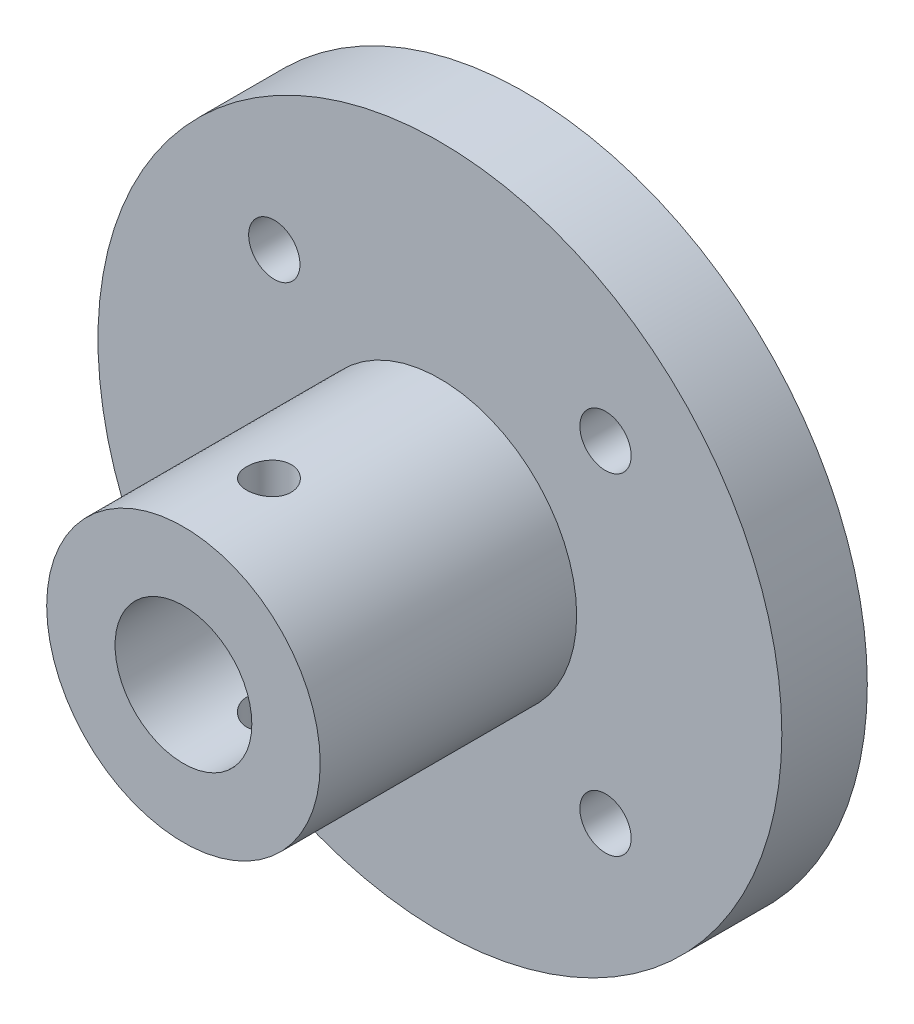
ISO-10303-21;
HEADER;
FILE_DESCRIPTION(('STEP AP214'),'2;1');
FILE_NAME('part.step','',(''),(''),'','','');
FILE_SCHEMA(('AUTOMOTIVE_DESIGN { 1 0 10303 214 1 1 1 1 }'));
ENDSEC;
DATA;
#1=APPLICATION_CONTEXT('core data for automotive mechanical design processes');
#2=APPLICATION_PROTOCOL_DEFINITION('international standard','automotive_design',2000,#1);
#3=PRODUCT_CONTEXT('',#1,'mechanical');
#4=PRODUCT('Part','Part','',(#3));
#5=PRODUCT_RELATED_PRODUCT_CATEGORY('part','',(#4));
#6=PRODUCT_DEFINITION_FORMATION('','',#4);
#7=PRODUCT_DEFINITION_CONTEXT('part definition',#1,'design');
#8=PRODUCT_DEFINITION('design','',#6,#7);
#9=PRODUCT_DEFINITION_SHAPE('','',#8);
#10=(LENGTH_UNIT() NAMED_UNIT(*) SI_UNIT(.MILLI.,.METRE.));
#11=(NAMED_UNIT(*) PLANE_ANGLE_UNIT() SI_UNIT($,.RADIAN.));
#12=(NAMED_UNIT(*) SI_UNIT($,.STERADIAN.) SOLID_ANGLE_UNIT());
#13=UNCERTAINTY_MEASURE_WITH_UNIT(LENGTH_MEASURE(1.E-05),#10,'distance_accuracy_value','');
#14=(GEOMETRIC_REPRESENTATION_CONTEXT(3) GLOBAL_UNCERTAINTY_ASSIGNED_CONTEXT((#13)) GLOBAL_UNIT_ASSIGNED_CONTEXT((#10,
#11,#12)) REPRESENTATION_CONTEXT('',''));
#15=CARTESIAN_POINT('',(0.,0.,0.));
#16=DIRECTION('',(0.,0.,1.));
#17=DIRECTION('',(1.,0.,0.));
#18=AXIS2_PLACEMENT_3D('',#15,#16,#17);
#19=CARTESIAN_POINT('',(0.,0.,5.));
#20=DIRECTION('',(0.,0.,1.));
#21=DIRECTION('',(1.,0.,0.));
#22=AXIS2_PLACEMENT_3D('',#19,#20,#21);
#23=PLANE('',#22);
#24=CARTESIAN_POINT('',(-9.68620346185681,-9.68620346185671,5.));
#25=DIRECTION('',(0.,0.,1.));
#26=DIRECTION('',(-1.,0.,0.));
#27=AXIS2_PLACEMENT_3D('',#24,#25,#26);
#28=CIRCLE('',#27,1.5);
#29=CARTESIAN_POINT('',(-11.1862034618568,-9.68620346185671,5.));
#30=VERTEX_POINT('',#29);
#31=EDGE_CURVE('E122',#30,#30,#28,.T.);
#32=ORIENTED_EDGE('',*,*,#31,.F.);
#33=EDGE_LOOP('',(#32));
#34=FACE_BOUND('',#33,.T.);
#35=CARTESIAN_POINT('',(9.68620346185681,9.68620346185671,5.));
#36=DIRECTION('',(0.,0.,1.));
#37=DIRECTION('',(-1.,0.,0.));
#38=AXIS2_PLACEMENT_3D('',#35,#36,#37);
#39=CIRCLE('',#38,1.5);
#40=CARTESIAN_POINT('',(8.18620346185681,9.68620346185671,5.));
#41=VERTEX_POINT('',#40);
#42=EDGE_CURVE('E136',#41,#41,#39,.T.);
#43=ORIENTED_EDGE('',*,*,#42,.F.);
#44=EDGE_LOOP('',(#43));
#45=FACE_BOUND('',#44,.T.);
#46=CARTESIAN_POINT('',(0.,0.,5.));
#47=DIRECTION('',(0.,0.,1.));
#48=DIRECTION('',(1.,0.,0.));
#49=AXIS2_PLACEMENT_3D('',#46,#47,#48);
#50=CIRCLE('',#49,20.);
#51=CARTESIAN_POINT('',(20.,0.,5.));
#52=VERTEX_POINT('',#51);
#53=EDGE_CURVE('E10',#52,#52,#50,.T.);
#54=ORIENTED_EDGE('',*,*,#53,.T.);
#55=EDGE_LOOP('',(#54));
#56=FACE_BOUND('',#55,.T.);
#57=CARTESIAN_POINT('',(-9.68620346185681,9.68620346185671,5.));
#58=DIRECTION('',(0.,0.,1.));
#59=DIRECTION('',(1.,0.,0.));
#60=AXIS2_PLACEMENT_3D('',#57,#58,#59);
#61=CIRCLE('',#60,1.5);
#62=CARTESIAN_POINT('',(-8.18620346185681,9.68620346185671,5.));
#63=VERTEX_POINT('',#62);
#64=EDGE_CURVE('E140',#63,#63,#61,.T.);
#65=ORIENTED_EDGE('',*,*,#64,.F.);
#66=EDGE_LOOP('',(#65));
#67=FACE_BOUND('',#66,.T.);
#68=CARTESIAN_POINT('',(9.68620346185681,-9.68620346185671,5.));
#69=DIRECTION('',(0.,0.,1.));
#70=DIRECTION('',(1.,0.,0.));
#71=AXIS2_PLACEMENT_3D('',#68,#69,#70);
#72=CIRCLE('',#71,1.5);
#73=CARTESIAN_POINT('',(11.1862034618568,-9.68620346185671,5.));
#74=VERTEX_POINT('',#73);
#75=EDGE_CURVE('E132',#74,#74,#72,.T.);
#76=ORIENTED_EDGE('',*,*,#75,.F.);
#77=EDGE_LOOP('',(#76));
#78=FACE_BOUND('',#77,.T.);
#79=CARTESIAN_POINT('',(0.,0.,5.));
#80=DIRECTION('',(0.,0.,1.));
#81=DIRECTION('',(1.,0.,0.));
#82=AXIS2_PLACEMENT_3D('',#79,#80,#81);
#83=CIRCLE('',#82,8.);
#84=CARTESIAN_POINT('',(8.,0.,5.));
#85=VERTEX_POINT('',#84);
#86=EDGE_CURVE('E128',#85,#85,#83,.T.);
#87=ORIENTED_EDGE('',*,*,#86,.F.);
#88=EDGE_LOOP('',(#87));
#89=FACE_BOUND('',#88,.T.);
#90=ADVANCED_FACE('F30',(#34,#45,#56,#67,#78,#89),#23,.T.);
#91=CARTESIAN_POINT('',(0.,0.,0.));
#92=DIRECTION('',(0.,0.,1.));
#93=DIRECTION('',(1.,0.,0.));
#94=AXIS2_PLACEMENT_3D('',#91,#92,#93);
#95=PLANE('',#94);
#96=CARTESIAN_POINT('',(0.,0.,0.));
#97=DIRECTION('',(0.,0.,1.));
#98=DIRECTION('',(1.,0.,0.));
#99=AXIS2_PLACEMENT_3D('',#96,#97,#98);
#100=CIRCLE('',#99,20.);
#101=CARTESIAN_POINT('',(20.,0.,0.));
#102=VERTEX_POINT('',#101);
#103=EDGE_CURVE('E43',#102,#102,#100,.T.);
#104=ORIENTED_EDGE('',*,*,#103,.F.);
#105=EDGE_LOOP('',(#104));
#106=FACE_BOUND('',#105,.T.);
#107=CARTESIAN_POINT('',(0.,0.,0.));
#108=DIRECTION('',(0.,0.,1.));
#109=DIRECTION('',(1.,0.,0.));
#110=AXIS2_PLACEMENT_3D('',#107,#108,#109);
#111=CIRCLE('',#110,4.);
#112=CARTESIAN_POINT('',(4.,0.,0.));
#113=VERTEX_POINT('',#112);
#114=EDGE_CURVE('E48',#113,#113,#111,.T.);
#115=ORIENTED_EDGE('',*,*,#114,.T.);
#116=EDGE_LOOP('',(#115));
#117=FACE_BOUND('',#116,.T.);
#118=CARTESIAN_POINT('',(-9.68620346185681,9.68620346185671,0.));
#119=DIRECTION('',(0.,0.,1.));
#120=DIRECTION('',(1.,0.,0.));
#121=AXIS2_PLACEMENT_3D('',#118,#119,#120);
#122=CIRCLE('',#121,1.5);
#123=CARTESIAN_POINT('',(-8.18620346185681,9.68620346185671,0.));
#124=VERTEX_POINT('',#123);
#125=EDGE_CURVE('E109',#124,#124,#122,.T.);
#126=ORIENTED_EDGE('',*,*,#125,.T.);
#127=EDGE_LOOP('',(#126));
#128=FACE_BOUND('',#127,.T.);
#129=CARTESIAN_POINT('',(9.68620346185681,9.68620346185671,0.));
#130=DIRECTION('',(0.,0.,1.));
#131=DIRECTION('',(-1.,0.,0.));
#132=AXIS2_PLACEMENT_3D('',#129,#130,#131);
#133=CIRCLE('',#132,1.5);
#134=CARTESIAN_POINT('',(8.18620346185681,9.68620346185671,0.));
#135=VERTEX_POINT('',#134);
#136=EDGE_CURVE('E113',#135,#135,#133,.T.);
#137=ORIENTED_EDGE('',*,*,#136,.T.);
#138=EDGE_LOOP('',(#137));
#139=FACE_BOUND('',#138,.T.);
#140=CARTESIAN_POINT('',(9.68620346185681,-9.68620346185671,0.));
#141=DIRECTION('',(0.,0.,1.));
#142=DIRECTION('',(1.,0.,0.));
#143=AXIS2_PLACEMENT_3D('',#140,#141,#142);
#144=CIRCLE('',#143,1.5);
#145=CARTESIAN_POINT('',(11.1862034618568,-9.68620346185671,0.));
#146=VERTEX_POINT('',#145);
#147=EDGE_CURVE('E117',#146,#146,#144,.T.);
#148=ORIENTED_EDGE('',*,*,#147,.T.);
#149=EDGE_LOOP('',(#148));
#150=FACE_BOUND('',#149,.T.);
#151=CARTESIAN_POINT('',(-9.68620346185681,-9.68620346185671,0.));
#152=DIRECTION('',(0.,0.,1.));
#153=DIRECTION('',(-1.,0.,0.));
#154=AXIS2_PLACEMENT_3D('',#151,#152,#153);
#155=CIRCLE('',#154,1.5);
#156=CARTESIAN_POINT('',(-11.1862034618568,-9.68620346185671,0.));
#157=VERTEX_POINT('',#156);
#158=EDGE_CURVE('E120',#157,#157,#155,.T.);
#159=ORIENTED_EDGE('',*,*,#158,.T.);
#160=EDGE_LOOP('',(#159));
#161=FACE_BOUND('',#160,.T.);
#162=ADVANCED_FACE('F93',(#106,#117,#128,#139,#150,#161),#95,.F.);
#163=CARTESIAN_POINT('',(0.,0.,5.));
#164=DIRECTION('',(0.,0.,-1.));
#165=DIRECTION('',(-1.,0.,0.));
#166=AXIS2_PLACEMENT_3D('',#163,#164,#165);
#167=CYLINDRICAL_SURFACE('',#166,20.);
#168=ORIENTED_EDGE('',*,*,#53,.F.);
#169=EDGE_LOOP('',(#168));
#170=FACE_BOUND('',#169,.T.);
#171=ORIENTED_EDGE('',*,*,#103,.T.);
#172=EDGE_LOOP('',(#171));
#173=FACE_BOUND('',#172,.T.);
#174=ADVANCED_FACE('F32',(#170,#173),#167,.T.);
#175=CARTESIAN_POINT('',(0.,0.,5.));
#176=DIRECTION('',(0.,0.,-1.));
#177=DIRECTION('',(-1.,0.,0.));
#178=AXIS2_PLACEMENT_3D('',#175,#176,#177);
#179=CYLINDRICAL_SURFACE('',#178,4.);
#180=CARTESIAN_POINT('',(0.,-4.,16.301925597688));
#181=CARTESIAN_POINT('',(0.0711312767951833,-3.99999997065091,16.3019256080283));
#182=CARTESIAN_POINT('',(0.142263208172782,-3.99808497215068,16.2960771024727));
#183=CARTESIAN_POINT('',(0.282437597376648,-3.99063390056981,16.2729052396162));
#184=CARTESIAN_POINT('',(0.351479739510248,-3.98509728321988,16.2555801575712));
#185=CARTESIAN_POINT('',(0.485433296175607,-3.97100581867374,16.2101079058586));
#186=CARTESIAN_POINT('',(0.55035122276099,-3.96245587668184,16.1819783175314));
#187=CARTESIAN_POINT('',(0.674548310374873,-3.9432143122473,16.1157732317819));
#188=CARTESIAN_POINT('',(0.733826439454097,-3.93252229896369,16.0776959189182));
#189=CARTESIAN_POINT('',(0.847029670563523,-3.90972846523015,15.9913471959365));
#190=CARTESIAN_POINT('',(0.900741471601737,-3.89759402865785,15.9428048012214));
#191=CARTESIAN_POINT('',(0.999423254499997,-3.87346600301855,15.8374803057087));
#192=CARTESIAN_POINT('',(1.04439142908575,-3.86147244355064,15.7806965056711));
#193=CARTESIAN_POINT('',(1.12550349477691,-3.83862869681929,15.6586091641631));
#194=CARTESIAN_POINT('',(1.16137427174797,-3.82781845461147,15.5931159812989));
#195=CARTESIAN_POINT('',(1.22150212221196,-3.8090591858432,15.4566178616921));
#196=CARTESIAN_POINT('',(1.2457625520848,-3.80110933255166,15.3856145247599));
#197=CARTESIAN_POINT('',(1.28118839331915,-3.78931351890477,15.242530263145));
#198=CARTESIAN_POINT('',(1.29275198118555,-3.78534313545761,15.1705584763495));
#199=CARTESIAN_POINT('',(1.30370036407857,-3.78158723404663,15.0255952092063));
#200=CARTESIAN_POINT('',(1.30308871699972,-3.78180049352214,14.952604032979));
#201=CARTESIAN_POINT('',(1.29001401704156,-3.78627844121784,14.8110300076271));
#202=CARTESIAN_POINT('',(1.27806534027109,-3.79036728103718,14.7423931385648));
#203=CARTESIAN_POINT('',(1.24349291036263,-3.80184873273346,14.608157066084));
#204=CARTESIAN_POINT('',(1.22086793460044,-3.80924172298867,14.5425582115166));
#205=CARTESIAN_POINT('',(1.16523835255127,-3.82662737214615,14.415069959991));
#206=CARTESIAN_POINT('',(1.13207786681771,-3.83665865526414,14.3532540755556));
#207=CARTESIAN_POINT('',(1.05642678798222,-3.85817385587477,14.2358992193946));
#208=CARTESIAN_POINT('',(1.01393360202195,-3.8696581766811,14.1803619985474));
#209=CARTESIAN_POINT('',(0.918332331110465,-3.89348252495641,14.0742437088007));
#210=CARTESIAN_POINT('',(0.864802122619727,-3.90583673490822,14.0240453647229));
#211=CARTESIAN_POINT('',(0.749930487003,-3.92950873282928,13.9332408405631));
#212=CARTESIAN_POINT('',(0.68858837961372,-3.94082643039087,13.8926354967238));
#213=CARTESIAN_POINT('',(0.559051032473993,-3.9612869666028,13.8218804524946));
#214=CARTESIAN_POINT('',(0.490798661954853,-3.97040914028853,13.7918289625452));
#215=CARTESIAN_POINT('',(0.349840187583072,-3.98530115684558,13.7437507455386));
#216=CARTESIAN_POINT('',(0.277135564473433,-3.99107210765427,13.7257200440338));
#217=CARTESIAN_POINT('',(0.132579747106289,-3.9984299209816,13.7028632328306));
#218=CARTESIAN_POINT('',(0.0608186096184757,-4.0001806688817,13.6975196021805));
#219=CARTESIAN_POINT('',(-0.0825865396790195,-3.99978971594145,13.6987201927588));
#220=CARTESIAN_POINT('',(-0.154230568389887,-3.99764863777213,13.7052625122997));
#221=CARTESIAN_POINT('',(-0.29332534584699,-3.98982262100815,13.7296374034796));
#222=CARTESIAN_POINT('',(-0.360837195106434,-3.98423628439791,13.7471560516628));
#223=CARTESIAN_POINT('',(-0.491939580492501,-3.97018209613516,13.7925974527317));
#224=CARTESIAN_POINT('',(-0.555529620463851,-3.9617138807706,13.820521518892));
#225=CARTESIAN_POINT('',(-0.678796591545226,-3.94249015618977,13.8867763598731));
#226=CARTESIAN_POINT('',(-0.738331648481139,-3.9316816357184,13.9253552764454));
#227=CARTESIAN_POINT('',(-0.850253337899065,-3.90900696570667,14.0115308657244));
#228=CARTESIAN_POINT('',(-0.902637871151955,-3.89714050726306,14.0591301768581));
#229=CARTESIAN_POINT('',(-1.00112459881444,-3.87303924238307,14.1644299347823));
#230=CARTESIAN_POINT('',(-1.04685758759963,-3.86081067179762,14.2224779446436));
#231=CARTESIAN_POINT('',(-1.12797430769858,-3.83789741641931,14.3456885193407));
#232=CARTESIAN_POINT('',(-1.16335805873627,-3.82721272868407,14.4108510706172));
#233=CARTESIAN_POINT('',(-1.22258385990192,-3.80870772235245,14.5464014694246));
#234=CARTESIAN_POINT('',(-1.24645828063114,-3.8008793853958,14.6167740119395));
#235=CARTESIAN_POINT('',(-1.2819189271213,-3.78906848592847,14.7608517057937));
#236=CARTESIAN_POINT('',(-1.2935103516984,-3.7850842964344,14.8345554334151));
#237=CARTESIAN_POINT('',(-1.30368248353493,-3.78159196355162,14.9793168745868));
#238=CARTESIAN_POINT('',(-1.30287320261135,-3.78187395064302,15.050327157676));
#239=CARTESIAN_POINT('',(-1.28975719355775,-3.78636677154468,15.1911447383842));
#240=CARTESIAN_POINT('',(-1.27745109051814,-3.79057739175234,15.2609521011967));
#241=CARTESIAN_POINT('',(-1.24211382967101,-3.8023003837088,15.39618946864));
#242=CARTESIAN_POINT('',(-1.21927136443201,-3.80975454004352,15.4616742148027));
#243=CARTESIAN_POINT('',(-1.16366087742788,-3.82710567421522,15.5879328447442));
#244=CARTESIAN_POINT('',(-1.13089071962521,-3.83700317767667,15.6487057111795));
#245=CARTESIAN_POINT('',(-1.05475011947038,-3.85864340925751,15.7665764057782));
#246=CARTESIAN_POINT('',(-1.01099278309618,-3.87044611152815,15.8234132507106));
#247=CARTESIAN_POINT('',(-0.914784185971263,-3.89430649647427,15.9291346414175));
#248=CARTESIAN_POINT('',(-0.862330519280606,-3.90636424890468,15.9780169790491));
#249=CARTESIAN_POINT('',(-0.747917545427117,-3.92990432370083,16.068235422746));
#250=CARTESIAN_POINT('',(-0.685681177634975,-3.9413495824801,16.1092309949832));
#251=CARTESIAN_POINT('',(-0.554830535895198,-3.96188587496537,16.1801295573846));
#252=CARTESIAN_POINT('',(-0.486218244138148,-3.97097763703696,16.210035980686));
#253=CARTESIAN_POINT('',(-0.348808825416258,-3.9853247740496,16.25629548467));
#254=CARTESIAN_POINT('',(-0.280269838762676,-3.99077761685879,16.2733541571706));
#255=CARTESIAN_POINT('',(-0.141153779142634,-3.99811480555621,16.2961678184661));
#256=CARTESIAN_POINT('',(-0.0705772117836242,-4.00000002912048,16.3019255874283));
#257=CARTESIAN_POINT('',(0.,-4.,16.301925597688));
#258=B_SPLINE_CURVE_WITH_KNOTS('',3,(#180,#181,#182,#183,#184,#185,#186,#187,#188,#189,#190,
#191,#192,#193,#194,#195,#196,#197,#198,#199,#200,#201,#202,#203,#204,#205,#206,#207,#208,#209,
#210,#211,#212,#213,#214,#215,#216,#217,#218,#219,#220,#221,#222,#223,#224,#225,#226,#227,#228,
#229,#230,#231,#232,#233,#234,#235,#236,#237,#238,#239,#240,#241,#242,#243,#244,#245,#246,#247,
#248,#249,#250,#251,#252,#253,#254,#255,#256,#257),.UNSPECIFIED.,.T.,.F.,(4,2,2,2,2,2,2,2,2,2,2,
2,2,2,2,2,2,2,2,2,2,2,2,2,2,2,2,2,2,2,2,2,2,2,2,2,2,2,4),(0.,0.213134225870454,
0.426300489643393,0.639121343914474,0.851981064766217,1.07121127660868,1.2904867544428,
1.51572310806076,1.74089430978393,1.9587823613108,2.17660674167868,2.38499816507355,
2.59341345874899,2.80506846796922,3.01678235481538,3.23900269629243,3.46124240205501,
3.6854985637765,3.90968054259402,4.12454779063682,4.33938066411337,4.54833340887738,
4.75731253463718,4.97164223198679,5.18603471688999,5.40968987899122,5.63334461484,
5.85636658580742,6.07929412428547,6.29129224936504,6.50327884862627,6.71160823150684,
6.91998247031033,7.13709485259694,7.35426740206832,7.57936621971548,7.80439528974902,
8.01592138739103,8.22739544037214),.UNSPECIFIED.);
#259=CARTESIAN_POINT('',(0.,-4.,16.301925597688));
#260=VERTEX_POINT('',#259);
#261=EDGE_CURVE('E78',#260,#260,#258,.T.);
#262=ORIENTED_EDGE('',*,*,#261,.F.);
#263=EDGE_LOOP('',(#262));
#264=FACE_BOUND('',#263,.T.);
#265=CARTESIAN_POINT('',(0.,4.,16.301925597688));
#266=CARTESIAN_POINT('',(-0.0711312767951798,3.99999997065091,16.3019256080283));
#267=CARTESIAN_POINT('',(-0.142263208172778,3.99808497215068,16.2960771024727));
#268=CARTESIAN_POINT('',(-0.282437597376644,3.99063390056981,16.2729052396162));
#269=CARTESIAN_POINT('',(-0.351479739510245,3.98509728321988,16.2555801575712));
#270=CARTESIAN_POINT('',(-0.485433296175603,3.97100581867374,16.2101079058586));
#271=CARTESIAN_POINT('',(-0.550351222760986,3.96245587668184,16.1819783175314));
#272=CARTESIAN_POINT('',(-0.674548310374869,3.9432143122473,16.1157732317819));
#273=CARTESIAN_POINT('',(-0.733826439454093,3.93252229896369,16.0776959189182));
#274=CARTESIAN_POINT('',(-0.847029670563519,3.90972846523015,15.9913471959365));
#275=CARTESIAN_POINT('',(-0.900741471601734,3.89759402865785,15.9428048012214));
#276=CARTESIAN_POINT('',(-0.999423254499993,3.87346600301855,15.8374803057087));
#277=CARTESIAN_POINT('',(-1.04439142908575,3.86147244355064,15.7806965056711));
#278=CARTESIAN_POINT('',(-1.12550349477691,3.83862869681929,15.6586091641631));
#279=CARTESIAN_POINT('',(-1.16137427174796,3.82781845461147,15.5931159812989));
#280=CARTESIAN_POINT('',(-1.22150212221195,3.8090591858432,15.4566178616921));
#281=CARTESIAN_POINT('',(-1.2457625520848,3.80110933255166,15.3856145247599));
#282=CARTESIAN_POINT('',(-1.28118839331915,3.78931351890477,15.242530263145));
#283=CARTESIAN_POINT('',(-1.29275198118554,3.78534313545761,15.1705584763495));
#284=CARTESIAN_POINT('',(-1.30370036407857,3.78158723404663,15.0255952092063));
#285=CARTESIAN_POINT('',(-1.30308871699971,3.78180049352214,14.952604032979));
#286=CARTESIAN_POINT('',(-1.29001401704156,3.78627844121784,14.8110300076271));
#287=CARTESIAN_POINT('',(-1.27806534027109,3.79036728103718,14.7423931385648));
#288=CARTESIAN_POINT('',(-1.24349291036263,3.80184873273346,14.608157066084));
#289=CARTESIAN_POINT('',(-1.22086793460043,3.80924172298867,14.5425582115166));
#290=CARTESIAN_POINT('',(-1.16523835255127,3.82662737214615,14.415069959991));
#291=CARTESIAN_POINT('',(-1.13207786681771,3.83665865526415,14.3532540755556));
#292=CARTESIAN_POINT('',(-1.05642678798221,3.85817385587477,14.2358992193946));
#293=CARTESIAN_POINT('',(-1.01393360202194,3.8696581766811,14.1803619985474));
#294=CARTESIAN_POINT('',(-0.918332331110462,3.89348252495641,14.0742437088007));
#295=CARTESIAN_POINT('',(-0.864802122619723,3.90583673490822,14.0240453647229));
#296=CARTESIAN_POINT('',(-0.749930487002996,3.92950873282928,13.9332408405631));
#297=CARTESIAN_POINT('',(-0.688588379613716,3.94082643039087,13.8926354967238));
#298=CARTESIAN_POINT('',(-0.559051032473989,3.9612869666028,13.8218804524946));
#299=CARTESIAN_POINT('',(-0.490798661954849,3.97040914028853,13.7918289625452));
#300=CARTESIAN_POINT('',(-0.349840187583068,3.98530115684558,13.7437507455386));
#301=CARTESIAN_POINT('',(-0.277135564473429,3.99107210765427,13.7257200440338));
#302=CARTESIAN_POINT('',(-0.132579747106286,3.9984299209816,13.7028632328306));
#303=CARTESIAN_POINT('',(-0.0608186096184719,4.0001806688817,13.6975196021805));
#304=CARTESIAN_POINT('',(0.0825865396790233,3.99978971594145,13.6987201927588));
#305=CARTESIAN_POINT('',(0.154230568389891,3.99764863777213,13.7052625122997));
#306=CARTESIAN_POINT('',(0.293325345846994,3.98982262100815,13.7296374034796));
#307=CARTESIAN_POINT('',(0.360837195106438,3.98423628439791,13.7471560516628));
#308=CARTESIAN_POINT('',(0.491939580492506,3.97018209613516,13.7925974527317));
#309=CARTESIAN_POINT('',(0.555529620463855,3.9617138807706,13.820521518892));
#310=CARTESIAN_POINT('',(0.67879659154523,3.94249015618977,13.8867763598731));
#311=CARTESIAN_POINT('',(0.738331648481142,3.9316816357184,13.9253552764454));
#312=CARTESIAN_POINT('',(0.850253337899068,3.90900696570667,14.0115308657244));
#313=CARTESIAN_POINT('',(0.902637871151959,3.89714050726306,14.0591301768581));
#314=CARTESIAN_POINT('',(1.00112459881444,3.87303924238307,14.1644299347823));
#315=CARTESIAN_POINT('',(1.04685758759963,3.86081067179762,14.2224779446436));
#316=CARTESIAN_POINT('',(1.12797430769858,3.8378974164193,14.3456885193407));
#317=CARTESIAN_POINT('',(1.16335805873628,3.82721272868407,14.4108510706172));
#318=CARTESIAN_POINT('',(1.22258385990193,3.80870772235244,14.5464014694246));
#319=CARTESIAN_POINT('',(1.24645828063114,3.8008793853958,14.6167740119395));
#320=CARTESIAN_POINT('',(1.2819189271213,3.78906848592847,14.7608517057937));
#321=CARTESIAN_POINT('',(1.2935103516984,3.7850842964344,14.8345554334151));
#322=CARTESIAN_POINT('',(1.30368248353493,3.78159196355161,14.9793168745868));
#323=CARTESIAN_POINT('',(1.30287320261135,3.78187395064302,15.050327157676));
#324=CARTESIAN_POINT('',(1.28975719355775,3.78636677154468,15.1911447383842));
#325=CARTESIAN_POINT('',(1.27745109051814,3.79057739175234,15.2609521011967));
#326=CARTESIAN_POINT('',(1.24211382967102,3.8023003837088,15.39618946864));
#327=CARTESIAN_POINT('',(1.21927136443201,3.80975454004351,15.4616742148027));
#328=CARTESIAN_POINT('',(1.16366087742789,3.82710567421522,15.5879328447442));
#329=CARTESIAN_POINT('',(1.13089071962521,3.83700317767667,15.6487057111795));
#330=CARTESIAN_POINT('',(1.05475011947038,3.85864340925751,15.7665764057782));
#331=CARTESIAN_POINT('',(1.01099278309618,3.87044611152814,15.8234132507106));
#332=CARTESIAN_POINT('',(0.914784185971266,3.89430649647427,15.9291346414175));
#333=CARTESIAN_POINT('',(0.862330519280609,3.90636424890468,15.9780169790491));
#334=CARTESIAN_POINT('',(0.74791754542712,3.92990432370083,16.068235422746));
#335=CARTESIAN_POINT('',(0.685681177634978,3.9413495824801,16.1092309949832));
#336=CARTESIAN_POINT('',(0.554830535895201,3.96188587496537,16.1801295573846));
#337=CARTESIAN_POINT('',(0.486218244138151,3.97097763703696,16.210035980686));
#338=CARTESIAN_POINT('',(0.348808825416261,3.9853247740496,16.25629548467));
#339=CARTESIAN_POINT('',(0.280269838762679,3.99077761685879,16.2733541571706));
#340=CARTESIAN_POINT('',(0.141153779142638,3.99811480555621,16.2961678184661));
#341=CARTESIAN_POINT('',(0.0705772117836276,4.00000002912048,16.3019255874283));
#342=CARTESIAN_POINT('',(0.,4.,16.301925597688));
#343=B_SPLINE_CURVE_WITH_KNOTS('',3,(#265,#266,#267,#268,#269,#270,#271,#272,#273,#274,#275,
#276,#277,#278,#279,#280,#281,#282,#283,#284,#285,#286,#287,#288,#289,#290,#291,#292,#293,#294,
#295,#296,#297,#298,#299,#300,#301,#302,#303,#304,#305,#306,#307,#308,#309,#310,#311,#312,#313,
#314,#315,#316,#317,#318,#319,#320,#321,#322,#323,#324,#325,#326,#327,#328,#329,#330,#331,#332,
#333,#334,#335,#336,#337,#338,#339,#340,#341,#342),.UNSPECIFIED.,.T.,.F.,(4,2,2,2,2,2,2,2,2,2,2,
2,2,2,2,2,2,2,2,2,2,2,2,2,2,2,2,2,2,2,2,2,2,2,2,2,2,2,4),(0.,0.213134225870454,
0.426300489643393,0.639121343914474,0.851981064766217,1.07121127660868,1.2904867544428,
1.51572310806076,1.74089430978393,1.9587823613108,2.17660674167868,2.38499816507355,
2.59341345874899,2.80506846796922,3.01678235481538,3.23900269629243,3.46124240205501,
3.6854985637765,3.90968054259402,4.12454779063682,4.33938066411337,4.54833340887738,
4.75731253463718,4.97164223198679,5.18603471688999,5.40968987899122,5.63334461484,
5.85636658580742,6.07929412428547,6.29129224936505,6.50327884862627,6.71160823150684,
6.91998247031033,7.13709485259694,7.35426740206832,7.57936621971548,7.80439528974902,
8.01592138739103,8.22739544037214),.UNSPECIFIED.);
#344=CARTESIAN_POINT('',(0.,4.,16.301925597688));
#345=VERTEX_POINT('',#344);
#346=EDGE_CURVE('E72',#345,#345,#343,.T.);
#347=ORIENTED_EDGE('',*,*,#346,.F.);
#348=EDGE_LOOP('',(#347));
#349=FACE_BOUND('',#348,.T.);
#350=ORIENTED_EDGE('',*,*,#114,.F.);
#351=EDGE_LOOP('',(#350));
#352=FACE_BOUND('',#351,.T.);
#353=CARTESIAN_POINT('',(0.,0.,20.));
#354=DIRECTION('',(0.,0.,1.));
#355=DIRECTION('',(1.,0.,0.));
#356=AXIS2_PLACEMENT_3D('',#353,#354,#355);
#357=CIRCLE('',#356,4.);
#358=CARTESIAN_POINT('',(4.,0.,20.));
#359=VERTEX_POINT('',#358);
#360=EDGE_CURVE('E152',#359,#359,#357,.T.);
#361=ORIENTED_EDGE('',*,*,#360,.T.);
#362=EDGE_LOOP('',(#361));
#363=FACE_BOUND('',#362,.T.);
#364=ADVANCED_FACE('F83',(#264,#349,#352,#363),#179,.F.);
#365=CARTESIAN_POINT('',(-9.68620346185681,9.68620346185671,5.));
#366=DIRECTION('',(0.,0.,-1.));
#367=DIRECTION('',(-1.,0.,0.));
#368=AXIS2_PLACEMENT_3D('',#365,#366,#367);
#369=CYLINDRICAL_SURFACE('',#368,1.5);
#370=ORIENTED_EDGE('',*,*,#64,.T.);
#371=EDGE_LOOP('',(#370));
#372=FACE_BOUND('',#371,.T.);
#373=ORIENTED_EDGE('',*,*,#125,.F.);
#374=EDGE_LOOP('',(#373));
#375=FACE_BOUND('',#374,.T.);
#376=ADVANCED_FACE('F88',(#372,#375),#369,.F.);
#377=CARTESIAN_POINT('',(9.68620346185681,9.68620346185671,5.));
#378=DIRECTION('',(0.,0.,-1.));
#379=DIRECTION('',(-1.,0.,0.));
#380=AXIS2_PLACEMENT_3D('',#377,#378,#379);
#381=CYLINDRICAL_SURFACE('',#380,1.5);
#382=ORIENTED_EDGE('',*,*,#42,.T.);
#383=EDGE_LOOP('',(#382));
#384=FACE_BOUND('',#383,.T.);
#385=ORIENTED_EDGE('',*,*,#136,.F.);
#386=EDGE_LOOP('',(#385));
#387=FACE_BOUND('',#386,.T.);
#388=ADVANCED_FACE('F183',(#384,#387),#381,.F.);
#389=CARTESIAN_POINT('',(9.68620346185681,-9.68620346185671,5.));
#390=DIRECTION('',(0.,0.,-1.));
#391=DIRECTION('',(-1.,0.,0.));
#392=AXIS2_PLACEMENT_3D('',#389,#390,#391);
#393=CYLINDRICAL_SURFACE('',#392,1.5);
#394=ORIENTED_EDGE('',*,*,#75,.T.);
#395=EDGE_LOOP('',(#394));
#396=FACE_BOUND('',#395,.T.);
#397=ORIENTED_EDGE('',*,*,#147,.F.);
#398=EDGE_LOOP('',(#397));
#399=FACE_BOUND('',#398,.T.);
#400=ADVANCED_FACE('F178',(#396,#399),#393,.F.);
#401=CARTESIAN_POINT('',(-9.68620346185681,-9.68620346185671,5.));
#402=DIRECTION('',(0.,0.,-1.));
#403=DIRECTION('',(-1.,0.,0.));
#404=AXIS2_PLACEMENT_3D('',#401,#402,#403);
#405=CYLINDRICAL_SURFACE('',#404,1.5);
#406=ORIENTED_EDGE('',*,*,#31,.T.);
#407=EDGE_LOOP('',(#406));
#408=FACE_BOUND('',#407,.T.);
#409=ORIENTED_EDGE('',*,*,#158,.F.);
#410=EDGE_LOOP('',(#409));
#411=FACE_BOUND('',#410,.T.);
#412=ADVANCED_FACE('F174',(#408,#411),#405,.F.);
#413=CARTESIAN_POINT('',(0.,0.,20.));
#414=DIRECTION('',(0.,0.,1.));
#415=DIRECTION('',(1.,0.,0.));
#416=AXIS2_PLACEMENT_3D('',#413,#414,#415);
#417=PLANE('',#416);
#418=CARTESIAN_POINT('',(0.,0.,20.));
#419=DIRECTION('',(0.,0.,1.));
#420=DIRECTION('',(1.,0.,0.));
#421=AXIS2_PLACEMENT_3D('',#418,#419,#420);
#422=CIRCLE('',#421,8.);
#423=CARTESIAN_POINT('',(8.,0.,20.));
#424=VERTEX_POINT('',#423);
#425=EDGE_CURVE('E123',#424,#424,#422,.T.);
#426=ORIENTED_EDGE('',*,*,#425,.T.);
#427=EDGE_LOOP('',(#426));
#428=FACE_BOUND('',#427,.T.);
#429=ORIENTED_EDGE('',*,*,#360,.F.);
#430=EDGE_LOOP('',(#429));
#431=FACE_BOUND('',#430,.T.);
#432=ADVANCED_FACE('F66',(#428,#431),#417,.T.);
#433=CARTESIAN_POINT('',(0.,0.,20.));
#434=DIRECTION('',(0.,0.,-1.));
#435=DIRECTION('',(-1.,0.,0.));
#436=AXIS2_PLACEMENT_3D('',#433,#434,#435);
#437=CYLINDRICAL_SURFACE('',#436,8.);
#438=CARTESIAN_POINT('',(0.,-8.,16.301925597688));
#439=CARTESIAN_POINT('',(0.0726154812771378,-7.99999877304601,16.3019226646682));
#440=CARTESIAN_POINT('',(0.145271207285782,-7.99900099705732,16.2958298367484));
#441=CARTESIAN_POINT('',(0.288546587968042,-7.9951167387072,16.2716286696691));
#442=CARTESIAN_POINT('',(0.359164279181477,-7.99222849456504,16.253509122248));
#443=CARTESIAN_POINT('',(0.496269815828486,-7.98488740630411,16.2058146796236));
#444=CARTESIAN_POINT('',(0.562760927370698,-7.98043581861546,16.1762489815307));
#445=CARTESIAN_POINT('',(0.689829628350651,-7.97045810299482,16.1065251963364));
#446=CARTESIAN_POINT('',(0.750407928186082,-7.96493210438774,16.0663683838611));
#447=CARTESIAN_POINT('',(0.864493581179434,-7.95336219547985,15.9762119713338));
#448=CARTESIAN_POINT('',(0.917939096426416,-7.94731442138239,15.9261346079341));
#449=CARTESIAN_POINT('',(1.01570805116992,-7.93541231911579,15.8177259817644));
#450=CARTESIAN_POINT('',(1.06003092773492,-7.92955800290307,15.7593942100135));
#451=CARTESIAN_POINT('',(1.13854254621549,-7.91866823227222,15.6357100520794));
#452=CARTESIAN_POINT('',(1.17267045839357,-7.91363777089482,15.5703185747771));
#453=CARTESIAN_POINT('',(1.22943444950572,-7.90501868337939,15.434635682502));
#454=CARTESIAN_POINT('',(1.25207126766794,-7.9014299644964,15.3643445830555));
#455=CARTESIAN_POINT('',(1.28501633285046,-7.89613904085071,15.2215120324336));
#456=CARTESIAN_POINT('',(1.29543112714903,-7.89442054188908,15.1489957718374));
#457=CARTESIAN_POINT('',(1.30396678982124,-7.89301530069185,15.0032261615564));
#458=CARTESIAN_POINT('',(1.30208848786081,-7.89332842134145,14.9299728619479));
#459=CARTESIAN_POINT('',(1.28617813197762,-7.89593615803214,14.7855672091446));
#460=CARTESIAN_POINT('',(1.27226551725269,-7.89821130055724,14.7144012936374));
#461=CARTESIAN_POINT('',(1.23286878980259,-7.90445626261759,14.5754274936882));
#462=CARTESIAN_POINT('',(1.2073842971055,-7.9084261378005,14.5076197195946));
#463=CARTESIAN_POINT('',(1.14544536719715,-7.91763441261594,14.3769280262487));
#464=CARTESIAN_POINT('',(1.10894108996224,-7.92287855399417,14.314068148929));
#465=CARTESIAN_POINT('',(1.02603422562257,-7.93404045331915,14.1953207516772));
#466=CARTESIAN_POINT('',(0.979630876030744,-7.93995826313956,14.139433769366));
#467=CARTESIAN_POINT('',(0.877591135270602,-7.95188639438553,14.035527007197));
#468=CARTESIAN_POINT('',(0.821852214296534,-7.95789698321382,13.987607888448));
#469=CARTESIAN_POINT('',(0.703070971278662,-7.96926878097484,13.901787855478));
#470=CARTESIAN_POINT('',(0.640028606154202,-7.9746299860767,13.8638870003558));
#471=CARTESIAN_POINT('',(0.508337179959086,-7.98410605459026,13.7991711793847));
#472=CARTESIAN_POINT('',(0.439683810412971,-7.98821994860497,13.7723648301924));
#473=CARTESIAN_POINT('',(0.298767594086919,-7.99473001455149,13.7306909231307));
#474=CARTESIAN_POINT('',(0.226505035523192,-7.99712632340932,13.7158224135643));
#475=CARTESIAN_POINT('',(0.0812896003079446,-7.99991287589468,13.6985820684029));
#476=CARTESIAN_POINT('',(0.00835354610211747,-8.00032530906246,13.6960719968398));
#477=CARTESIAN_POINT('',(-0.136897192531536,-7.99915832419853,13.7032516337039));
#478=CARTESIAN_POINT('',(-0.209211899620205,-7.99757897912108,13.7129408952975));
#479=CARTESIAN_POINT('',(-0.350742232068427,-7.99261962799478,13.7441291834347));
#480=CARTESIAN_POINT('',(-0.419973275789506,-7.98925001957977,13.7655600384291));
#481=CARTESIAN_POINT('',(-0.553859793706442,-7.98108651895957,13.8195506886438));
#482=CARTESIAN_POINT('',(-0.618515020752015,-7.976292549894,13.852111084443));
#483=CARTESIAN_POINT('',(-0.742016846147357,-7.96575729934662,13.9277550321985));
#484=CARTESIAN_POINT('',(-0.800809688220899,-7.96000834824488,13.9709252620295));
#485=CARTESIAN_POINT('',(-0.910365649587973,-7.94822470782197,14.0664438478051));
#486=CARTESIAN_POINT('',(-0.961128213955851,-7.94218999879113,14.1187928375137));
#487=CARTESIAN_POINT('',(-1.05369277245768,-7.93044357969678,14.231801832954));
#488=CARTESIAN_POINT('',(-1.09540154387389,-7.92473563827234,14.2925386494659));
#489=CARTESIAN_POINT('',(-1.16802424871126,-7.91435851785286,14.4202376989663));
#490=CARTESIAN_POINT('',(-1.19893851255175,-7.90968930706392,14.4871997413215));
#491=CARTESIAN_POINT('',(-1.24895399171133,-7.90194635348704,14.6251835474994));
#492=CARTESIAN_POINT('',(-1.26810225691113,-7.89886626415468,14.6961878848473));
#493=CARTESIAN_POINT('',(-1.29419068174635,-7.89463413662949,14.8404591780437));
#494=CARTESIAN_POINT('',(-1.30113184865768,-7.89348193935589,14.9137259466987));
#495=CARTESIAN_POINT('',(-1.30258195642585,-7.89324268727788,15.059511871946));
#496=CARTESIAN_POINT('',(-1.29723759198183,-7.89413126460241,15.1320295713685));
#497=CARTESIAN_POINT('',(-1.27458485049378,-7.89782014537259,15.275119507032));
#498=CARTESIAN_POINT('',(-1.25727650712385,-7.90062044343745,15.3456917487482));
#499=CARTESIAN_POINT('',(-1.21124228329201,-7.9078081625656,15.4828346742169));
#500=CARTESIAN_POINT('',(-1.18252845442488,-7.9121939079292,15.5494094966341));
#501=CARTESIAN_POINT('',(-1.11451328055342,-7.92206007747459,15.6768206267516));
#502=CARTESIAN_POINT('',(-1.07521145070565,-7.92754055178301,15.7376566714908));
#503=CARTESIAN_POINT('',(-0.986610045021606,-7.93905619253421,15.8526055189493));
#504=CARTESIAN_POINT('',(-0.937202362631372,-7.94509693431205,15.9066344470846));
#505=CARTESIAN_POINT('',(-0.830019925104729,-7.95700749821389,16.0056852002167));
#506=CARTESIAN_POINT('',(-0.772243238843318,-7.96287728051297,16.0507049406421));
#507=CARTESIAN_POINT('',(-0.649513708313684,-7.97382900721807,16.1307277255507));
#508=CARTESIAN_POINT('',(-0.584516308252591,-7.97890553531871,16.1656631784512));
#509=CARTESIAN_POINT('',(-0.449520575109127,-7.98764599475312,16.2240666782912));
#510=CARTESIAN_POINT('',(-0.379527353219571,-7.991311345977,16.2475462582305));
#511=CARTESIAN_POINT('',(-0.257709638745891,-7.99600755006165,16.2772186022716));
#512=CARTESIAN_POINT('',(-0.206625918931347,-7.99749679348154,16.2864690549016));
#513=CARTESIAN_POINT('',(-0.103701633810479,-7.99949344875137,16.298823550912));
#514=CARTESIAN_POINT('',(-0.051861080599859,-8.0000008762754,16.3019276924146));
#515=CARTESIAN_POINT('',(0.,-8.,16.301925597688));
#516=B_SPLINE_CURVE_WITH_KNOTS('',3,(#438,#439,#440,#441,#442,#443,#444,#445,#446,#447,#448,
#449,#450,#451,#452,#453,#454,#455,#456,#457,#458,#459,#460,#461,#462,#463,#464,#465,#466,#467,
#468,#469,#470,#471,#472,#473,#474,#475,#476,#477,#478,#479,#480,#481,#482,#483,#484,#485,#486,
#487,#488,#489,#490,#491,#492,#493,#494,#495,#496,#497,#498,#499,#500,#501,#502,#503,#504,#505,
#506,#507,#508,#509,#510,#511,#512,#513,#514,#515),.UNSPECIFIED.,.T.,.F.,(4,2,2,2,2,2,2,2,2,2,2,
2,2,2,2,2,2,2,2,2,2,2,2,2,2,2,2,2,2,2,2,2,2,2,2,2,2,2,4),(0.,0.217656891727491,
0.435516913422752,0.653202244255275,0.870861388899118,1.09029947681952,1.30975110156962,
1.53048709946223,1.75120889549157,1.96999187615193,2.18876009121478,2.40538164937493,
2.6220103209928,2.83963382040476,3.05727408856564,3.27748361156862,3.49769443358255,
3.71807596498952,3.93843992561021,4.15633330384745,4.37421870138202,4.59085226222413,
4.80749751502261,5.02597520372512,5.24446798355739,5.46511370672391,5.68575267534383,
5.90550351123592,6.12523621340734,6.34235885843438,6.55948089234521,6.7763741121876,
6.99327726564553,7.21263500788995,7.43204344721068,7.6528900619265,7.87351388205053,
8.02896422976871,8.18441209579489),.UNSPECIFIED.);
#517=CARTESIAN_POINT('',(0.,-8.,16.301925597688));
#518=VERTEX_POINT('',#517);
#519=EDGE_CURVE('E34',#518,#518,#516,.T.);
#520=ORIENTED_EDGE('',*,*,#519,.T.);
#521=EDGE_LOOP('',(#520));
#522=FACE_BOUND('',#521,.T.);
#523=CARTESIAN_POINT('',(0.,8.,16.301925597688));
#524=CARTESIAN_POINT('',(-0.0726154812771344,7.99999877304601,16.3019226646682));
#525=CARTESIAN_POINT('',(-0.145271207285778,7.99900099705732,16.2958298367484));
#526=CARTESIAN_POINT('',(-0.288546587968038,7.9951167387072,16.2716286696691));
#527=CARTESIAN_POINT('',(-0.359164279181474,7.99222849456504,16.253509122248));
#528=CARTESIAN_POINT('',(-0.496269815828483,7.98488740630411,16.2058146796236));
#529=CARTESIAN_POINT('',(-0.562760927370695,7.98043581861546,16.1762489815307));
#530=CARTESIAN_POINT('',(-0.689829628350648,7.97045810299482,16.1065251963364));
#531=CARTESIAN_POINT('',(-0.750407928186079,7.96493210438774,16.0663683838611));
#532=CARTESIAN_POINT('',(-0.86449358117943,7.95336219547985,15.9762119713338));
#533=CARTESIAN_POINT('',(-0.917939096426412,7.94731442138239,15.9261346079341));
#534=CARTESIAN_POINT('',(-1.01570805116992,7.93541231911579,15.8177259817644));
#535=CARTESIAN_POINT('',(-1.06003092773492,7.92955800290307,15.7593942100135));
#536=CARTESIAN_POINT('',(-1.13854254621549,7.91866823227222,15.6357100520794));
#537=CARTESIAN_POINT('',(-1.17267045839356,7.91363777089482,15.5703185747771));
#538=CARTESIAN_POINT('',(-1.22943444950572,7.90501868337939,15.434635682502));
#539=CARTESIAN_POINT('',(-1.25207126766793,7.9014299644964,15.3643445830555));
#540=CARTESIAN_POINT('',(-1.28501633285045,7.89613904085071,15.2215120324336));
#541=CARTESIAN_POINT('',(-1.29543112714903,7.89442054188908,15.1489957718374));
#542=CARTESIAN_POINT('',(-1.30396678982124,7.89301530069186,15.0032261615564));
#543=CARTESIAN_POINT('',(-1.3020884878608,7.89332842134145,14.9299728619479));
#544=CARTESIAN_POINT('',(-1.28617813197762,7.89593615803214,14.7855672091446));
#545=CARTESIAN_POINT('',(-1.27226551725269,7.89821130055724,14.7144012936374));
#546=CARTESIAN_POINT('',(-1.23286878980259,7.90445626261759,14.5754274936882));
#547=CARTESIAN_POINT('',(-1.20738429710549,7.9084261378005,14.5076197195946));
#548=CARTESIAN_POINT('',(-1.14544536719715,7.91763441261594,14.3769280262487));
#549=CARTESIAN_POINT('',(-1.10894108996224,7.92287855399417,14.314068148929));
#550=CARTESIAN_POINT('',(-1.02603422562257,7.93404045331915,14.1953207516772));
#551=CARTESIAN_POINT('',(-0.97963087603074,7.93995826313956,14.139433769366));
#552=CARTESIAN_POINT('',(-0.877591135270599,7.95188639438554,14.035527007197));
#553=CARTESIAN_POINT('',(-0.821852214296531,7.95789698321382,13.987607888448));
#554=CARTESIAN_POINT('',(-0.703070971278659,7.96926878097484,13.901787855478));
#555=CARTESIAN_POINT('',(-0.640028606154198,7.9746299860767,13.8638870003558));
#556=CARTESIAN_POINT('',(-0.508337179959082,7.98410605459026,13.7991711793847));
#557=CARTESIAN_POINT('',(-0.439683810412967,7.98821994860497,13.7723648301924));
#558=CARTESIAN_POINT('',(-0.298767594086915,7.99473001455149,13.7306909231307));
#559=CARTESIAN_POINT('',(-0.226505035523188,7.99712632340932,13.7158224135643));
#560=CARTESIAN_POINT('',(-0.0812896003079406,7.99991287589468,13.6985820684029));
#561=CARTESIAN_POINT('',(-0.00835354610211335,8.00032530906246,13.6960719968398));
#562=CARTESIAN_POINT('',(0.13689719253154,7.99915832419853,13.7032516337039));
#563=CARTESIAN_POINT('',(0.209211899620209,7.99757897912108,13.7129408952975));
#564=CARTESIAN_POINT('',(0.350742232068431,7.99261962799477,13.7441291834347));
#565=CARTESIAN_POINT('',(0.41997327578951,7.98925001957977,13.7655600384291));
#566=CARTESIAN_POINT('',(0.553859793706446,7.98108651895957,13.8195506886438));
#567=CARTESIAN_POINT('',(0.618515020752019,7.976292549894,13.852111084443));
#568=CARTESIAN_POINT('',(0.742016846147361,7.96575729934662,13.9277550321985));
#569=CARTESIAN_POINT('',(0.800809688220902,7.96000834824488,13.9709252620295));
#570=CARTESIAN_POINT('',(0.910365649587977,7.94822470782197,14.0664438478051));
#571=CARTESIAN_POINT('',(0.961128213955855,7.94218999879113,14.1187928375137));
#572=CARTESIAN_POINT('',(1.05369277245768,7.93044357969678,14.231801832954));
#573=CARTESIAN_POINT('',(1.09540154387389,7.92473563827234,14.2925386494659));
#574=CARTESIAN_POINT('',(1.16802424871126,7.91435851785286,14.4202376989663));
#575=CARTESIAN_POINT('',(1.19893851255176,7.90968930706392,14.4871997413215));
#576=CARTESIAN_POINT('',(1.24895399171133,7.90194635348704,14.6251835474994));
#577=CARTESIAN_POINT('',(1.26810225691113,7.89886626415468,14.6961878848473));
#578=CARTESIAN_POINT('',(1.29419068174635,7.89463413662949,14.8404591780437));
#579=CARTESIAN_POINT('',(1.30113184865768,7.89348193935589,14.9137259466987));
#580=CARTESIAN_POINT('',(1.30258195642585,7.89324268727788,15.059511871946));
#581=CARTESIAN_POINT('',(1.29723759198183,7.89413126460241,15.1320295713685));
#582=CARTESIAN_POINT('',(1.27458485049378,7.89782014537259,15.275119507032));
#583=CARTESIAN_POINT('',(1.25727650712385,7.90062044343745,15.3456917487482));
#584=CARTESIAN_POINT('',(1.21124228329201,7.9078081625656,15.4828346742169));
#585=CARTESIAN_POINT('',(1.18252845442489,7.9121939079292,15.5494094966341));
#586=CARTESIAN_POINT('',(1.11451328055342,7.92206007747459,15.6768206267516));
#587=CARTESIAN_POINT('',(1.07521145070565,7.92754055178301,15.7376566714908));
#588=CARTESIAN_POINT('',(0.986610045021609,7.93905619253421,15.8526055189493));
#589=CARTESIAN_POINT('',(0.937202362631376,7.94509693431205,15.9066344470846));
#590=CARTESIAN_POINT('',(0.830019925104733,7.95700749821389,16.0056852002167));
#591=CARTESIAN_POINT('',(0.772243238843321,7.96287728051297,16.0507049406421));
#592=CARTESIAN_POINT('',(0.649513708313687,7.97382900721807,16.1307277255507));
#593=CARTESIAN_POINT('',(0.584516308252594,7.97890553531871,16.1656631784512));
#594=CARTESIAN_POINT('',(0.44952057510913,7.98764599475312,16.2240666782912));
#595=CARTESIAN_POINT('',(0.379527353219574,7.991311345977,16.2475462582305));
#596=CARTESIAN_POINT('',(0.257709638745895,7.99600755006165,16.2772186022716));
#597=CARTESIAN_POINT('',(0.20662591893135,7.99749679348154,16.2864690549016));
#598=CARTESIAN_POINT('',(0.103701633810482,7.99949344875137,16.298823550912));
#599=CARTESIAN_POINT('',(0.0518610805998625,8.0000008762754,16.3019276924146));
#600=CARTESIAN_POINT('',(0.,8.,16.301925597688));
#601=B_SPLINE_CURVE_WITH_KNOTS('',3,(#523,#524,#525,#526,#527,#528,#529,#530,#531,#532,#533,
#534,#535,#536,#537,#538,#539,#540,#541,#542,#543,#544,#545,#546,#547,#548,#549,#550,#551,#552,
#553,#554,#555,#556,#557,#558,#559,#560,#561,#562,#563,#564,#565,#566,#567,#568,#569,#570,#571,
#572,#573,#574,#575,#576,#577,#578,#579,#580,#581,#582,#583,#584,#585,#586,#587,#588,#589,#590,
#591,#592,#593,#594,#595,#596,#597,#598,#599,#600),.UNSPECIFIED.,.T.,.F.,(4,2,2,2,2,2,2,2,2,2,2,
2,2,2,2,2,2,2,2,2,2,2,2,2,2,2,2,2,2,2,2,2,2,2,2,2,2,2,4),(0.,0.217656891727491,
0.435516913422752,0.653202244255275,0.870861388899118,1.09029947681952,1.30975110156962,
1.53048709946223,1.75120889549157,1.96999187615194,2.18876009121478,2.40538164937493,
2.6220103209928,2.83963382040476,3.05727408856564,3.27748361156862,3.49769443358255,
3.71807596498952,3.93843992561021,4.15633330384745,4.37421870138202,4.59085226222413,
4.80749751502261,5.02597520372511,5.24446798355739,5.46511370672391,5.68575267534383,
5.90550351123592,6.12523621340734,6.34235885843438,6.55948089234521,6.7763741121876,
6.99327726564552,7.21263500788995,7.43204344721068,7.6528900619265,7.87351388205053,
8.02896422976871,8.18441209579489),.UNSPECIFIED.);
#602=CARTESIAN_POINT('',(0.,8.,16.301925597688));
#603=VERTEX_POINT('',#602);
#604=EDGE_CURVE('E52',#603,#603,#601,.T.);
#605=ORIENTED_EDGE('',*,*,#604,.T.);
#606=EDGE_LOOP('',(#605));
#607=FACE_BOUND('',#606,.T.);
#608=ORIENTED_EDGE('',*,*,#425,.F.);
#609=EDGE_LOOP('',(#608));
#610=FACE_BOUND('',#609,.T.);
#611=ORIENTED_EDGE('',*,*,#86,.T.);
#612=EDGE_LOOP('',(#611));
#613=FACE_BOUND('',#612,.T.);
#614=ADVANCED_FACE('F57',(#522,#607,#610,#613),#437,.T.);
#615=CARTESIAN_POINT('',(0.,-20.,15.));
#616=DIRECTION('',(0.,1.,0.));
#617=DIRECTION('',(0.,0.,1.));
#618=AXIS2_PLACEMENT_3D('',#615,#616,#617);
#619=CYLINDRICAL_SURFACE('',#618,1.30192559768803);
#620=ORIENTED_EDGE('',*,*,#346,.T.);
#621=EDGE_LOOP('',(#620));
#622=FACE_BOUND('',#621,.T.);
#623=ORIENTED_EDGE('',*,*,#604,.F.);
#624=EDGE_LOOP('',(#623));
#625=FACE_BOUND('',#624,.T.);
#626=ADVANCED_FACE('F64',(#622,#625),#619,.F.);
#627=ORIENTED_EDGE('',*,*,#261,.T.);
#628=EDGE_LOOP('',(#627));
#629=FACE_BOUND('',#628,.T.);
#630=ORIENTED_EDGE('',*,*,#519,.F.);
#631=EDGE_LOOP('',(#630));
#632=FACE_BOUND('',#631,.T.);
#633=ADVANCED_FACE('F61',(#629,#632),#619,.F.);
#634=CLOSED_SHELL('',(#90,#162,#174,#364,#376,#388,#400,#412,#432,#614,#626,#633));
#635=MANIFOLD_SOLID_BREP('B2',#634);
#636=ADVANCED_BREP_SHAPE_REPRESENTATION('',(#18,#635),#14);
#637=SHAPE_DEFINITION_REPRESENTATION(#9,#636);
ENDSEC;
END-ISO-10303-21;
